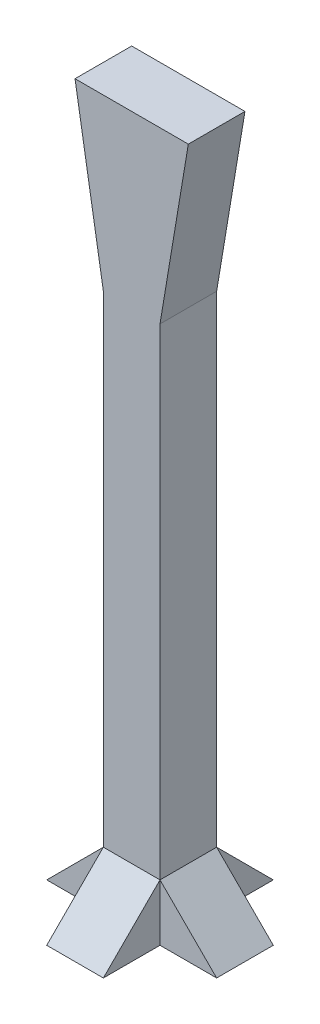
ISO-10303-21;
HEADER;
FILE_DESCRIPTION(('STEP AP214'),'2;1');
FILE_NAME('part.step','',(''),(''),'','','');
FILE_SCHEMA(('AUTOMOTIVE_DESIGN { 1 0 10303 214 1 1 1 1 }'));
ENDSEC;
DATA;
#1=APPLICATION_CONTEXT('core data for automotive mechanical design processes');
#2=APPLICATION_PROTOCOL_DEFINITION('international standard','automotive_design',2000,#1);
#3=PRODUCT_CONTEXT('',#1,'mechanical');
#4=PRODUCT('Part','Part','',(#3));
#5=PRODUCT_RELATED_PRODUCT_CATEGORY('part','',(#4));
#6=PRODUCT_DEFINITION_FORMATION('','',#4);
#7=PRODUCT_DEFINITION_CONTEXT('part definition',#1,'design');
#8=PRODUCT_DEFINITION('design','',#6,#7);
#9=PRODUCT_DEFINITION_SHAPE('','',#8);
#10=(LENGTH_UNIT() NAMED_UNIT(*) SI_UNIT(.MILLI.,.METRE.));
#11=(NAMED_UNIT(*) PLANE_ANGLE_UNIT() SI_UNIT($,.RADIAN.));
#12=(NAMED_UNIT(*) SI_UNIT($,.STERADIAN.) SOLID_ANGLE_UNIT());
#13=UNCERTAINTY_MEASURE_WITH_UNIT(LENGTH_MEASURE(1.E-05),#10,'distance_accuracy_value','');
#14=(GEOMETRIC_REPRESENTATION_CONTEXT(3) GLOBAL_UNCERTAINTY_ASSIGNED_CONTEXT((#13)) GLOBAL_UNIT_ASSIGNED_CONTEXT((#10,
#11,#12)) REPRESENTATION_CONTEXT('',''));
#15=CARTESIAN_POINT('',(0.,0.,0.));
#16=DIRECTION('',(0.,0.,1.));
#17=DIRECTION('',(1.,0.,0.));
#18=AXIS2_PLACEMENT_3D('',#15,#16,#17);
#19=CARTESIAN_POINT('',(10.,-125.,20.));
#20=DIRECTION('',(-1.,0.,0.));
#21=DIRECTION('',(0.,0.,1.));
#22=AXIS2_PLACEMENT_3D('',#19,#20,#21);
#23=PLANE('',#22);
#24=DIRECTION('',(0.,0.,1.));
#25=VECTOR('',#24,1.);
#26=CARTESIAN_POINT('',(10.,65.0000000000002,-60.8276253029822));
#27=LINE('',#26,#25);
#28=CARTESIAN_POINT('',(10.,65.0000000000002,0.));
#29=VERTEX_POINT('',#28);
#30=CARTESIAN_POINT('',(10.,65.0000000000002,20.));
#31=VERTEX_POINT('',#30);
#32=EDGE_CURVE('E49',#29,#31,#27,.T.);
#33=ORIENTED_EDGE('',*,*,#32,.T.);
#34=DIRECTION('',(0.,1.,0.));
#35=VECTOR('',#34,1.);
#36=CARTESIAN_POINT('',(10.,-125.,20.));
#37=LINE('',#36,#35);
#38=CARTESIAN_POINT('',(10.,-105.,20.));
#39=VERTEX_POINT('',#38);
#40=EDGE_CURVE('E225',#39,#31,#37,.T.);
#41=ORIENTED_EDGE('',*,*,#40,.F.);
#42=DIRECTION('',(0.,0.,1.));
#43=VECTOR('',#42,1.);
#44=CARTESIAN_POINT('',(10.,-105.,-28.2842712474619));
#45=LINE('',#44,#43);
#46=CARTESIAN_POINT('',(10.,-105.,0.));
#47=VERTEX_POINT('',#46);
#48=EDGE_CURVE('E219',#47,#39,#45,.T.);
#49=ORIENTED_EDGE('',*,*,#48,.F.);
#50=DIRECTION('',(0.,1.,0.));
#51=VECTOR('',#50,1.);
#52=CARTESIAN_POINT('',(10.,-125.,0.));
#53=LINE('',#52,#51);
#54=EDGE_CURVE('E54',#47,#29,#53,.T.);
#55=ORIENTED_EDGE('',*,*,#54,.T.);
#56=EDGE_LOOP('',(#33,#41,#49,#55));
#57=FACE_BOUND('',#56,.T.);
#58=ADVANCED_FACE('F33',(#57),#23,.F.);
#59=CARTESIAN_POINT('',(0.,0.,0.));
#60=DIRECTION('',(0.,0.,-1.));
#61=DIRECTION('',(-1.,0.,0.));
#62=AXIS2_PLACEMENT_3D('',#59,#60,#61);
#63=PLANE('',#62);
#64=DIRECTION('',(0.707106781186547,0.707106781186548,0.));
#65=VECTOR('',#64,1.);
#66=CARTESIAN_POINT('',(-10.,-105.,0.));
#67=LINE('',#66,#65);
#68=CARTESIAN_POINT('',(-30.,-125.,0.));
#69=VERTEX_POINT('',#68);
#70=CARTESIAN_POINT('',(-10.,-105.,0.));
#71=VERTEX_POINT('',#70);
#72=EDGE_CURVE('E207',#69,#71,#67,.T.);
#73=ORIENTED_EDGE('',*,*,#72,.T.);
#74=DIRECTION('',(0.,-1.,0.));
#75=VECTOR('',#74,1.);
#76=CARTESIAN_POINT('',(-10.,-105.,0.));
#77=LINE('',#76,#75);
#78=CARTESIAN_POINT('',(-10.,-125.,0.));
#79=VERTEX_POINT('',#78);
#80=EDGE_CURVE('E163',#71,#79,#77,.T.);
#81=ORIENTED_EDGE('',*,*,#80,.T.);
#82=DIRECTION('',(1.,0.,0.));
#83=VECTOR('',#82,1.);
#84=CARTESIAN_POINT('',(-10.,-125.,0.));
#85=LINE('',#84,#83);
#86=EDGE_CURVE('E36',#69,#79,#85,.T.);
#87=ORIENTED_EDGE('',*,*,#86,.F.);
#88=EDGE_LOOP('',(#73,#81,#87));
#89=FACE_BOUND('',#88,.T.);
#90=ADVANCED_FACE('F242',(#89),#63,.T.);
#91=CARTESIAN_POINT('',(10.,-125.,0.));
#92=VERTEX_POINT('',#91);
#93=CARTESIAN_POINT('',(30.,-125.,0.));
#94=VERTEX_POINT('',#93);
#95=EDGE_CURVE('E230',#92,#94,#85,.T.);
#96=ORIENTED_EDGE('',*,*,#95,.F.);
#97=DIRECTION('',(0.,1.,0.));
#98=VECTOR('',#97,1.);
#99=CARTESIAN_POINT('',(10.,-105.,0.));
#100=LINE('',#99,#98);
#101=EDGE_CURVE('E169',#92,#47,#100,.T.);
#102=ORIENTED_EDGE('',*,*,#101,.T.);
#103=DIRECTION('',(-0.707106781186547,0.707106781186548,0.));
#104=VECTOR('',#103,1.);
#105=CARTESIAN_POINT('',(10.,-105.,0.));
#106=LINE('',#105,#104);
#107=EDGE_CURVE('E216',#94,#47,#106,.T.);
#108=ORIENTED_EDGE('',*,*,#107,.F.);
#109=EDGE_LOOP('',(#96,#102,#108));
#110=FACE_BOUND('',#109,.T.);
#111=ADVANCED_FACE('F277',(#110),#63,.T.);
#112=CARTESIAN_POINT('',(0.,0.,20.));
#113=DIRECTION('',(0.,0.,-1.));
#114=DIRECTION('',(-1.,0.,0.));
#115=AXIS2_PLACEMENT_3D('',#112,#113,#114);
#116=PLANE('',#115);
#117=DIRECTION('',(0.,-1.,0.));
#118=VECTOR('',#117,1.);
#119=CARTESIAN_POINT('',(-10.,-105.,20.));
#120=LINE('',#119,#118);
#121=CARTESIAN_POINT('',(-10.,-105.,20.));
#122=VERTEX_POINT('',#121);
#123=CARTESIAN_POINT('',(-10.,-125.,20.));
#124=VERTEX_POINT('',#123);
#125=EDGE_CURVE('E181',#122,#124,#120,.T.);
#126=ORIENTED_EDGE('',*,*,#125,.F.);
#127=DIRECTION('',(0.707106781186547,0.707106781186548,0.));
#128=VECTOR('',#127,1.);
#129=CARTESIAN_POINT('',(-10.,-105.,20.));
#130=LINE('',#129,#128);
#131=CARTESIAN_POINT('',(-30.,-125.,20.));
#132=VERTEX_POINT('',#131);
#133=EDGE_CURVE('E203',#132,#122,#130,.T.);
#134=ORIENTED_EDGE('',*,*,#133,.F.);
#135=DIRECTION('',(1.,0.,0.));
#136=VECTOR('',#135,1.);
#137=CARTESIAN_POINT('',(-10.,-125.,20.));
#138=LINE('',#137,#136);
#139=EDGE_CURVE('E11',#132,#124,#138,.T.);
#140=ORIENTED_EDGE('',*,*,#139,.T.);
#141=EDGE_LOOP('',(#126,#134,#140));
#142=FACE_BOUND('',#141,.T.);
#143=ADVANCED_FACE('F262',(#142),#116,.F.);
#144=DIRECTION('',(0.,1.,0.));
#145=VECTOR('',#144,1.);
#146=CARTESIAN_POINT('',(10.,-105.,20.));
#147=LINE('',#146,#145);
#148=CARTESIAN_POINT('',(10.,-125.,20.));
#149=VERTEX_POINT('',#148);
#150=EDGE_CURVE('E194',#149,#39,#147,.T.);
#151=ORIENTED_EDGE('',*,*,#150,.F.);
#152=CARTESIAN_POINT('',(30.,-125.,20.));
#153=VERTEX_POINT('',#152);
#154=EDGE_CURVE('E41',#149,#153,#138,.T.);
#155=ORIENTED_EDGE('',*,*,#154,.T.);
#156=DIRECTION('',(-0.707106781186547,0.707106781186548,0.));
#157=VECTOR('',#156,1.);
#158=CARTESIAN_POINT('',(10.,-105.,20.));
#159=LINE('',#158,#157);
#160=EDGE_CURVE('E210',#153,#39,#159,.T.);
#161=ORIENTED_EDGE('',*,*,#160,.T.);
#162=EDGE_LOOP('',(#151,#155,#161));
#163=FACE_BOUND('',#162,.T.);
#164=ADVANCED_FACE('F268',(#163),#116,.F.);
#165=CARTESIAN_POINT('',(-10.,125.,20.));
#166=DIRECTION('',(0.,-1.,0.));
#167=DIRECTION('',(0.,0.,-1.));
#168=AXIS2_PLACEMENT_3D('',#165,#166,#167);
#169=PLANE('',#168);
#170=DIRECTION('',(-1.,0.,0.));
#171=VECTOR('',#170,1.);
#172=CARTESIAN_POINT('',(-10.,125.,0.));
#173=LINE('',#172,#171);
#174=CARTESIAN_POINT('',(20.,125.,0.));
#175=VERTEX_POINT('',#174);
#176=CARTESIAN_POINT('',(-20.,125.,0.));
#177=VERTEX_POINT('',#176);
#178=EDGE_CURVE('E122',#175,#177,#173,.T.);
#179=ORIENTED_EDGE('',*,*,#178,.T.);
#180=DIRECTION('',(0.,0.,1.));
#181=VECTOR('',#180,1.);
#182=CARTESIAN_POINT('',(-20.,125.,-60.8276253029822));
#183=LINE('',#182,#181);
#184=CARTESIAN_POINT('',(-20.,125.,20.));
#185=VERTEX_POINT('',#184);
#186=EDGE_CURVE('E148',#177,#185,#183,.T.);
#187=ORIENTED_EDGE('',*,*,#186,.T.);
#188=DIRECTION('',(-1.,0.,0.));
#189=VECTOR('',#188,1.);
#190=CARTESIAN_POINT('',(-10.,125.,20.));
#191=LINE('',#190,#189);
#192=CARTESIAN_POINT('',(20.,125.,20.));
#193=VERTEX_POINT('',#192);
#194=EDGE_CURVE('E138',#193,#185,#191,.T.);
#195=ORIENTED_EDGE('',*,*,#194,.F.);
#196=DIRECTION('',(0.,0.,1.));
#197=VECTOR('',#196,1.);
#198=CARTESIAN_POINT('',(20.,125.,-60.8276253029822));
#199=LINE('',#198,#197);
#200=EDGE_CURVE('E136',#175,#193,#199,.T.);
#201=ORIENTED_EDGE('',*,*,#200,.F.);
#202=EDGE_LOOP('',(#179,#187,#195,#201));
#203=FACE_BOUND('',#202,.T.);
#204=ADVANCED_FACE('F137',(#203),#169,.F.);
#205=CARTESIAN_POINT('',(-10.,-125.,20.));
#206=DIRECTION('',(1.,0.,0.));
#207=DIRECTION('',(0.,0.,-1.));
#208=AXIS2_PLACEMENT_3D('',#205,#206,#207);
#209=PLANE('',#208);
#210=DIRECTION('',(0.,-1.,0.));
#211=VECTOR('',#210,1.);
#212=CARTESIAN_POINT('',(-10.,-125.,20.));
#213=LINE('',#212,#211);
#214=CARTESIAN_POINT('',(-10.,65.0000000000002,20.));
#215=VERTEX_POINT('',#214);
#216=EDGE_CURVE('E228',#215,#122,#213,.T.);
#217=ORIENTED_EDGE('',*,*,#216,.F.);
#218=DIRECTION('',(0.,0.,1.));
#219=VECTOR('',#218,1.);
#220=CARTESIAN_POINT('',(-10.,65.0000000000002,-60.8276253029822));
#221=LINE('',#220,#219);
#222=CARTESIAN_POINT('',(-10.,65.0000000000002,0.));
#223=VERTEX_POINT('',#222);
#224=EDGE_CURVE('E154',#223,#215,#221,.T.);
#225=ORIENTED_EDGE('',*,*,#224,.F.);
#226=DIRECTION('',(0.,-1.,0.));
#227=VECTOR('',#226,1.);
#228=CARTESIAN_POINT('',(-10.,-125.,0.));
#229=LINE('',#228,#227);
#230=EDGE_CURVE('E133',#223,#71,#229,.T.);
#231=ORIENTED_EDGE('',*,*,#230,.T.);
#232=DIRECTION('',(0.,0.,1.));
#233=VECTOR('',#232,1.);
#234=CARTESIAN_POINT('',(-10.,-105.,-28.2842712474619));
#235=LINE('',#234,#233);
#236=EDGE_CURVE('E206',#71,#122,#235,.T.);
#237=ORIENTED_EDGE('',*,*,#236,.T.);
#238=EDGE_LOOP('',(#217,#225,#231,#237));
#239=FACE_BOUND('',#238,.T.);
#240=ADVANCED_FACE('F247',(#239),#209,.F.);
#241=CARTESIAN_POINT('',(-10.,-125.,20.));
#242=DIRECTION('',(0.,1.,0.));
#243=DIRECTION('',(0.,0.,1.));
#244=AXIS2_PLACEMENT_3D('',#241,#242,#243);
#245=PLANE('',#244);
#246=ORIENTED_EDGE('',*,*,#86,.T.);
#247=DIRECTION('',(0.,0.,-1.));
#248=VECTOR('',#247,1.);
#249=CARTESIAN_POINT('',(-10.,-125.,0.));
#250=LINE('',#249,#248);
#251=CARTESIAN_POINT('',(-10.,-125.,-20.));
#252=VERTEX_POINT('',#251);
#253=EDGE_CURVE('E159',#79,#252,#250,.T.);
#254=ORIENTED_EDGE('',*,*,#253,.T.);
#255=DIRECTION('',(1.,0.,0.));
#256=VECTOR('',#255,1.);
#257=CARTESIAN_POINT('',(-38.2842712474619,-125.,-20.));
#258=LINE('',#257,#256);
#259=CARTESIAN_POINT('',(10.,-125.,-20.));
#260=VERTEX_POINT('',#259);
#261=EDGE_CURVE('E175',#252,#260,#258,.T.);
#262=ORIENTED_EDGE('',*,*,#261,.T.);
#263=DIRECTION('',(0.,0.,1.));
#264=VECTOR('',#263,1.);
#265=CARTESIAN_POINT('',(10.,-125.,0.));
#266=LINE('',#265,#264);
#267=EDGE_CURVE('E172',#260,#92,#266,.T.);
#268=ORIENTED_EDGE('',*,*,#267,.T.);
#269=ORIENTED_EDGE('',*,*,#95,.T.);
#270=DIRECTION('',(0.,0.,1.));
#271=VECTOR('',#270,1.);
#272=CARTESIAN_POINT('',(30.,-125.,-28.2842712474619));
#273=LINE('',#272,#271);
#274=EDGE_CURVE('E222',#94,#153,#273,.T.);
#275=ORIENTED_EDGE('',*,*,#274,.T.);
#276=ORIENTED_EDGE('',*,*,#154,.F.);
#277=DIRECTION('',(0.,0.,-1.));
#278=VECTOR('',#277,1.);
#279=CARTESIAN_POINT('',(10.,-125.,20.));
#280=LINE('',#279,#278);
#281=CARTESIAN_POINT('',(10.,-125.,40.));
#282=VERTEX_POINT('',#281);
#283=EDGE_CURVE('E191',#282,#149,#280,.T.);
#284=ORIENTED_EDGE('',*,*,#283,.F.);
#285=DIRECTION('',(1.,0.,0.));
#286=VECTOR('',#285,1.);
#287=CARTESIAN_POINT('',(-38.2842712474619,-125.,40.));
#288=LINE('',#287,#286);
#289=CARTESIAN_POINT('',(-10.,-125.,40.));
#290=VERTEX_POINT('',#289);
#291=EDGE_CURVE('E197',#290,#282,#288,.T.);
#292=ORIENTED_EDGE('',*,*,#291,.F.);
#293=DIRECTION('',(0.,0.,1.));
#294=VECTOR('',#293,1.);
#295=CARTESIAN_POINT('',(-10.,-125.,20.));
#296=LINE('',#295,#294);
#297=EDGE_CURVE('E188',#124,#290,#296,.T.);
#298=ORIENTED_EDGE('',*,*,#297,.F.);
#299=ORIENTED_EDGE('',*,*,#139,.F.);
#300=DIRECTION('',(0.,0.,1.));
#301=VECTOR('',#300,1.);
#302=CARTESIAN_POINT('',(-30.,-125.,-28.2842712474619));
#303=LINE('',#302,#301);
#304=EDGE_CURVE('E202',#69,#132,#303,.T.);
#305=ORIENTED_EDGE('',*,*,#304,.F.);
#306=EDGE_LOOP('',(#246,#254,#262,#268,#269,#275,#276,#284,#292,#298,#299,#305));
#307=FACE_BOUND('',#306,.T.);
#308=ADVANCED_FACE('F239',(#307),#245,.F.);
#309=ORIENTED_EDGE('',*,*,#194,.T.);
#310=DIRECTION('',(0.164398987305357,-0.986393923832144,0.));
#311=VECTOR('',#310,1.);
#312=CARTESIAN_POINT('',(-20.,125.,20.));
#313=LINE('',#312,#311);
#314=EDGE_CURVE('E145',#185,#215,#313,.T.);
#315=ORIENTED_EDGE('',*,*,#314,.T.);
#316=ORIENTED_EDGE('',*,*,#216,.T.);
#317=DIRECTION('',(1.,0.,0.));
#318=VECTOR('',#317,1.);
#319=CARTESIAN_POINT('',(-38.2842712474619,-105.,20.));
#320=LINE('',#319,#318);
#321=EDGE_CURVE('E185',#122,#39,#320,.T.);
#322=ORIENTED_EDGE('',*,*,#321,.T.);
#323=ORIENTED_EDGE('',*,*,#40,.T.);
#324=DIRECTION('',(-0.164398987305357,-0.986393923832144,0.));
#325=VECTOR('',#324,1.);
#326=CARTESIAN_POINT('',(20.,125.,20.));
#327=LINE('',#326,#325);
#328=EDGE_CURVE('E142',#193,#31,#327,.T.);
#329=ORIENTED_EDGE('',*,*,#328,.F.);
#330=EDGE_LOOP('',(#309,#315,#316,#322,#323,#329));
#331=FACE_BOUND('',#330,.T.);
#332=ADVANCED_FACE('F259',(#331),#116,.F.);
#333=DIRECTION('',(1.,0.,0.));
#334=VECTOR('',#333,1.);
#335=CARTESIAN_POINT('',(-38.2842712474619,-105.,0.));
#336=LINE('',#335,#334);
#337=EDGE_CURVE('E174',#71,#47,#336,.T.);
#338=ORIENTED_EDGE('',*,*,#337,.F.);
#339=ORIENTED_EDGE('',*,*,#230,.F.);
#340=DIRECTION('',(0.164398987305357,-0.986393923832144,0.));
#341=VECTOR('',#340,1.);
#342=CARTESIAN_POINT('',(-20.,125.,0.));
#343=LINE('',#342,#341);
#344=EDGE_CURVE('E129',#177,#223,#343,.T.);
#345=ORIENTED_EDGE('',*,*,#344,.F.);
#346=ORIENTED_EDGE('',*,*,#178,.F.);
#347=DIRECTION('',(-0.164398987305357,-0.986393923832144,0.));
#348=VECTOR('',#347,1.);
#349=CARTESIAN_POINT('',(20.,125.,0.));
#350=LINE('',#349,#348);
#351=EDGE_CURVE('E127',#175,#29,#350,.T.);
#352=ORIENTED_EDGE('',*,*,#351,.T.);
#353=ORIENTED_EDGE('',*,*,#54,.F.);
#354=EDGE_LOOP('',(#338,#339,#345,#346,#352,#353));
#355=FACE_BOUND('',#354,.T.);
#356=ADVANCED_FACE('F125',(#355),#63,.T.);
#357=CARTESIAN_POINT('',(10.,-105.,-28.2842712474619));
#358=DIRECTION('',(0.707106781186548,0.707106781186547,0.));
#359=DIRECTION('',(-0.707106781186547,0.707106781186548,0.));
#360=AXIS2_PLACEMENT_3D('',#357,#358,#359);
#361=PLANE('',#360);
#362=ORIENTED_EDGE('',*,*,#274,.F.);
#363=ORIENTED_EDGE('',*,*,#107,.T.);
#364=ORIENTED_EDGE('',*,*,#48,.T.);
#365=ORIENTED_EDGE('',*,*,#160,.F.);
#366=EDGE_LOOP('',(#362,#363,#364,#365));
#367=FACE_BOUND('',#366,.T.);
#368=ADVANCED_FACE('F272',(#367),#361,.T.);
#369=CARTESIAN_POINT('',(-10.,-105.,-28.2842712474619));
#370=DIRECTION('',(0.707106781186548,-0.707106781186547,0.));
#371=DIRECTION('',(0.707106781186547,0.707106781186548,0.));
#372=AXIS2_PLACEMENT_3D('',#369,#370,#371);
#373=PLANE('',#372);
#374=ORIENTED_EDGE('',*,*,#72,.F.);
#375=ORIENTED_EDGE('',*,*,#304,.T.);
#376=ORIENTED_EDGE('',*,*,#133,.T.);
#377=ORIENTED_EDGE('',*,*,#236,.F.);
#378=EDGE_LOOP('',(#374,#375,#376,#377));
#379=FACE_BOUND('',#378,.T.);
#380=ADVANCED_FACE('F245',(#379),#373,.F.);
#381=CARTESIAN_POINT('',(-38.2842712474619,-125.,40.));
#382=DIRECTION('',(0.,0.707106781186547,0.707106781186548));
#383=DIRECTION('',(0.,-0.707106781186548,0.707106781186547));
#384=AXIS2_PLACEMENT_3D('',#381,#382,#383);
#385=PLANE('',#384);
#386=DIRECTION('',(0.,0.707106781186548,-0.707106781186547));
#387=VECTOR('',#386,1.);
#388=CARTESIAN_POINT('',(-10.,-125.,40.));
#389=LINE('',#388,#387);
#390=EDGE_CURVE('E184',#290,#122,#389,.T.);
#391=ORIENTED_EDGE('',*,*,#390,.F.);
#392=ORIENTED_EDGE('',*,*,#291,.T.);
#393=DIRECTION('',(0.,-0.707106781186548,0.707106781186547));
#394=VECTOR('',#393,1.);
#395=CARTESIAN_POINT('',(10.,-125.,40.));
#396=LINE('',#395,#394);
#397=EDGE_CURVE('E166',#39,#282,#396,.T.);
#398=ORIENTED_EDGE('',*,*,#397,.F.);
#399=ORIENTED_EDGE('',*,*,#321,.F.);
#400=EDGE_LOOP('',(#391,#392,#398,#399));
#401=FACE_BOUND('',#400,.T.);
#402=ADVANCED_FACE('F257',(#401),#385,.T.);
#403=CARTESIAN_POINT('',(10.,0.,0.));
#404=DIRECTION('',(-1.,0.,0.));
#405=DIRECTION('',(0.,0.,1.));
#406=AXIS2_PLACEMENT_3D('',#403,#404,#405);
#407=PLANE('',#406);
#408=ORIENTED_EDGE('',*,*,#397,.T.);
#409=ORIENTED_EDGE('',*,*,#283,.T.);
#410=ORIENTED_EDGE('',*,*,#150,.T.);
#411=EDGE_LOOP('',(#408,#409,#410));
#412=FACE_BOUND('',#411,.T.);
#413=ADVANCED_FACE('F266',(#412),#407,.F.);
#414=CARTESIAN_POINT('',(-10.,-125.,20.));
#415=DIRECTION('',(1.,0.,0.));
#416=DIRECTION('',(0.,0.,-1.));
#417=AXIS2_PLACEMENT_3D('',#414,#415,#416);
#418=PLANE('',#417);
#419=ORIENTED_EDGE('',*,*,#390,.T.);
#420=ORIENTED_EDGE('',*,*,#125,.T.);
#421=ORIENTED_EDGE('',*,*,#297,.T.);
#422=EDGE_LOOP('',(#419,#420,#421));
#423=FACE_BOUND('',#422,.T.);
#424=ADVANCED_FACE('F251',(#423),#418,.F.);
#425=CARTESIAN_POINT('',(10.,0.,20.));
#426=DIRECTION('',(-1.,0.,0.));
#427=DIRECTION('',(0.,0.,-1.));
#428=AXIS2_PLACEMENT_3D('',#425,#426,#427);
#429=PLANE('',#428);
#430=DIRECTION('',(0.,-0.707106781186548,-0.707106781186547));
#431=VECTOR('',#430,1.);
#432=CARTESIAN_POINT('',(10.,-125.,-20.));
#433=LINE('',#432,#431);
#434=EDGE_CURVE('E157',#47,#260,#433,.T.);
#435=ORIENTED_EDGE('',*,*,#434,.F.);
#436=ORIENTED_EDGE('',*,*,#101,.F.);
#437=ORIENTED_EDGE('',*,*,#267,.F.);
#438=EDGE_LOOP('',(#435,#436,#437));
#439=FACE_BOUND('',#438,.T.);
#440=ADVANCED_FACE('F341',(#439),#429,.F.);
#441=CARTESIAN_POINT('',(-38.2842712474619,-125.,-20.));
#442=DIRECTION('',(0.,-0.707106781186547,0.707106781186548));
#443=DIRECTION('',(0.,-0.707106781186548,-0.707106781186547));
#444=AXIS2_PLACEMENT_3D('',#441,#442,#443);
#445=PLANE('',#444);
#446=ORIENTED_EDGE('',*,*,#261,.F.);
#447=DIRECTION('',(0.,0.707106781186548,0.707106781186547));
#448=VECTOR('',#447,1.);
#449=CARTESIAN_POINT('',(-10.,-125.,-20.));
#450=LINE('',#449,#448);
#451=EDGE_CURVE('E162',#252,#71,#450,.T.);
#452=ORIENTED_EDGE('',*,*,#451,.T.);
#453=ORIENTED_EDGE('',*,*,#337,.T.);
#454=ORIENTED_EDGE('',*,*,#434,.T.);
#455=EDGE_LOOP('',(#446,#452,#453,#454));
#456=FACE_BOUND('',#455,.T.);
#457=ADVANCED_FACE('F345',(#456),#445,.F.);
#458=CARTESIAN_POINT('',(-10.,-125.,20.));
#459=DIRECTION('',(1.,0.,0.));
#460=DIRECTION('',(0.,0.,-1.));
#461=AXIS2_PLACEMENT_3D('',#458,#459,#460);
#462=PLANE('',#461);
#463=ORIENTED_EDGE('',*,*,#253,.F.);
#464=ORIENTED_EDGE('',*,*,#80,.F.);
#465=ORIENTED_EDGE('',*,*,#451,.F.);
#466=EDGE_LOOP('',(#463,#464,#465));
#467=FACE_BOUND('',#466,.T.);
#468=ADVANCED_FACE('F355',(#467),#462,.F.);
#469=CARTESIAN_POINT('',(-20.,125.,-60.8276253029822));
#470=DIRECTION('',(-0.986393923832144,-0.164398987305357,0.));
#471=DIRECTION('',(0.164398987305357,-0.986393923832144,0.));
#472=AXIS2_PLACEMENT_3D('',#469,#470,#471);
#473=PLANE('',#472);
#474=ORIENTED_EDGE('',*,*,#186,.F.);
#475=ORIENTED_EDGE('',*,*,#344,.T.);
#476=ORIENTED_EDGE('',*,*,#224,.T.);
#477=ORIENTED_EDGE('',*,*,#314,.F.);
#478=EDGE_LOOP('',(#474,#475,#476,#477));
#479=FACE_BOUND('',#478,.T.);
#480=ADVANCED_FACE('F364',(#479),#473,.T.);
#481=CARTESIAN_POINT('',(20.,125.,-60.8276253029822));
#482=DIRECTION('',(-0.986393923832144,0.164398987305357,0.));
#483=DIRECTION('',(-0.164398987305357,-0.986393923832144,0.));
#484=AXIS2_PLACEMENT_3D('',#481,#482,#483);
#485=PLANE('',#484);
#486=ORIENTED_EDGE('',*,*,#351,.F.);
#487=ORIENTED_EDGE('',*,*,#200,.T.);
#488=ORIENTED_EDGE('',*,*,#328,.T.);
#489=ORIENTED_EDGE('',*,*,#32,.F.);
#490=EDGE_LOOP('',(#486,#487,#488,#489));
#491=FACE_BOUND('',#490,.T.);
#492=ADVANCED_FACE('F144',(#491),#485,.F.);
#493=CLOSED_SHELL('',(#58,#90,#111,#143,#164,#204,#240,#308,#332,#356,#368,#380,#402,#413,#424,
#440,#457,#468,#480,#492));
#494=MANIFOLD_SOLID_BREP('B2',#493);
#495=ADVANCED_BREP_SHAPE_REPRESENTATION('',(#18,#494),#14);
#496=SHAPE_DEFINITION_REPRESENTATION(#9,#495);
ENDSEC;
END-ISO-10303-21;
